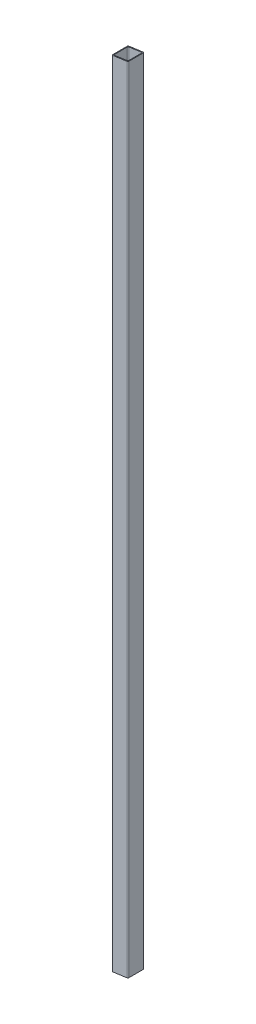
ISO-10303-21;
HEADER;
FILE_DESCRIPTION(('STEP AP214'),'2;1');
FILE_NAME('part.step','',(''),(''),'','','');
FILE_SCHEMA(('AUTOMOTIVE_DESIGN { 1 0 10303 214 1 1 1 1 }'));
ENDSEC;
DATA;
#1=APPLICATION_CONTEXT('core data for automotive mechanical design processes');
#2=APPLICATION_PROTOCOL_DEFINITION('international standard','automotive_design',2000,#1);
#3=PRODUCT_CONTEXT('',#1,'mechanical');
#4=PRODUCT('Part','Part','',(#3));
#5=PRODUCT_RELATED_PRODUCT_CATEGORY('part','',(#4));
#6=PRODUCT_DEFINITION_FORMATION('','',#4);
#7=PRODUCT_DEFINITION_CONTEXT('part definition',#1,'design');
#8=PRODUCT_DEFINITION('design','',#6,#7);
#9=PRODUCT_DEFINITION_SHAPE('','',#8);
#10=(LENGTH_UNIT() NAMED_UNIT(*) SI_UNIT(.MILLI.,.METRE.));
#11=(NAMED_UNIT(*) PLANE_ANGLE_UNIT() SI_UNIT($,.RADIAN.));
#12=(NAMED_UNIT(*) SI_UNIT($,.STERADIAN.) SOLID_ANGLE_UNIT());
#13=UNCERTAINTY_MEASURE_WITH_UNIT(LENGTH_MEASURE(1.E-05),#10,'distance_accuracy_value','');
#14=(GEOMETRIC_REPRESENTATION_CONTEXT(3) GLOBAL_UNCERTAINTY_ASSIGNED_CONTEXT((#13)) GLOBAL_UNIT_ASSIGNED_CONTEXT((#10,
#11,#12)) REPRESENTATION_CONTEXT('',''));
#15=CARTESIAN_POINT('',(0.,0.,0.));
#16=DIRECTION('',(0.,0.,1.));
#17=DIRECTION('',(1.,0.,0.));
#18=AXIS2_PLACEMENT_3D('',#15,#16,#17);
#19=CARTESIAN_POINT('',(5.,4950.,10.));
#20=DIRECTION('',(1.,0.,0.));
#21=DIRECTION('',(0.,0.,-1.));
#22=AXIS2_PLACEMENT_3D('',#19,#20,#21);
#23=PLANE('',#22);
#24=DIRECTION('',(0.,0.,-1.));
#25=VECTOR('',#24,1.);
#26=CARTESIAN_POINT('',(5.,4936.64862070327,10.));
#27=LINE('',#26,#25);
#28=CARTESIAN_POINT('',(5.00000000000001,4936.64862070327,90.));
#29=VERTEX_POINT('',#28);
#30=CARTESIAN_POINT('',(5.,4936.64862070327,10.));
#31=VERTEX_POINT('',#30);
#32=EDGE_CURVE('E11',#29,#31,#27,.T.);
#33=ORIENTED_EDGE('',*,*,#32,.F.);
#34=DIRECTION('',(0.,-1.,0.));
#35=VECTOR('',#34,1.);
#36=CARTESIAN_POINT('',(5.00000000000001,4950.,90.));
#37=LINE('',#36,#35);
#38=CARTESIAN_POINT('',(5.00000000000001,0.702704173511927,90.));
#39=VERTEX_POINT('',#38);
#40=EDGE_CURVE('E220',#29,#39,#37,.T.);
#41=ORIENTED_EDGE('',*,*,#40,.T.);
#42=DIRECTION('',(0.,0.,-1.));
#43=VECTOR('',#42,1.);
#44=CARTESIAN_POINT('',(5.,0.702704173511925,10.0000000000001));
#45=LINE('',#44,#43);
#46=CARTESIAN_POINT('',(5.,0.702704173511925,10.));
#47=VERTEX_POINT('',#46);
#48=EDGE_CURVE('E49',#39,#47,#45,.T.);
#49=ORIENTED_EDGE('',*,*,#48,.T.);
#50=DIRECTION('',(0.,-1.,0.));
#51=VECTOR('',#50,1.);
#52=CARTESIAN_POINT('',(5.,4950.,10.));
#53=LINE('',#52,#51);
#54=EDGE_CURVE('E217',#31,#47,#53,.T.);
#55=ORIENTED_EDGE('',*,*,#54,.F.);
#56=EDGE_LOOP('',(#33,#41,#49,#55));
#57=FACE_BOUND('',#56,.T.);
#58=ADVANCED_FACE('F41',(#57),#23,.T.);
#59=CARTESIAN_POINT('',(10.,4950.,10.));
#60=DIRECTION('',(0.,-1.,0.));
#61=DIRECTION('',(0.,0.,-1.));
#62=AXIS2_PLACEMENT_3D('',#59,#60,#61);
#63=CYLINDRICAL_SURFACE('',#62,5.);
#64=CARTESIAN_POINT('',(10.,4937.35132487678,10.));
#65=DIRECTION('',(0.139173100960068,-0.99026806874157,0.));
#66=DIRECTION('',(-0.99026806874157,-0.139173100960068,0.));
#67=AXIS2_PLACEMENT_3D('',#64,#65,#66);
#68=ELLIPSE('',#67,5.04913786259309,5.);
#69=CARTESIAN_POINT('',(10.,4937.35132487678,5.));
#70=VERTEX_POINT('',#69);
#71=EDGE_CURVE('E169',#31,#70,#68,.T.);
#72=ORIENTED_EDGE('',*,*,#71,.F.);
#73=ORIENTED_EDGE('',*,*,#54,.T.);
#74=CARTESIAN_POINT('',(10.,1.40540834702296,10.));
#75=DIRECTION('',(0.139173100960058,-0.990268068741571,0.));
#76=DIRECTION('',(-0.990268068741571,-0.139173100960058,0.));
#77=AXIS2_PLACEMENT_3D('',#74,#75,#76);
#78=ELLIPSE('',#77,5.04913786259308,5.);
#79=CARTESIAN_POINT('',(10.,1.40540834702296,5.));
#80=VERTEX_POINT('',#79);
#81=EDGE_CURVE('E274',#47,#80,#78,.T.);
#82=ORIENTED_EDGE('',*,*,#81,.T.);
#83=DIRECTION('',(0.,-1.,0.));
#84=VECTOR('',#83,1.);
#85=CARTESIAN_POINT('',(10.,4950.,5.));
#86=LINE('',#85,#84);
#87=EDGE_CURVE('E214',#70,#80,#86,.T.);
#88=ORIENTED_EDGE('',*,*,#87,.F.);
#89=EDGE_LOOP('',(#72,#73,#82,#88));
#90=FACE_BOUND('',#89,.T.);
#91=ADVANCED_FACE('F314',(#90),#63,.F.);
#92=CARTESIAN_POINT('',(10.,4950.,5.));
#93=DIRECTION('',(0.,0.,1.));
#94=DIRECTION('',(1.,0.,0.));
#95=AXIS2_PLACEMENT_3D('',#92,#93,#94);
#96=PLANE('',#95);
#97=DIRECTION('',(0.99026806874157,0.139173100960068,0.));
#98=VECTOR('',#97,1.);
#99=CARTESIAN_POINT('',(11.7432236827758,4937.59631898823,5.));
#100=LINE('',#99,#98);
#101=CARTESIAN_POINT('',(90.,4948.59459165298,4.99999999999998));
#102=VERTEX_POINT('',#101);
#103=EDGE_CURVE('E246',#70,#102,#100,.T.);
#104=ORIENTED_EDGE('',*,*,#103,.F.);
#105=ORIENTED_EDGE('',*,*,#87,.T.);
#106=DIRECTION('',(0.990268068741571,0.139173100960058,0.));
#107=VECTOR('',#106,1.);
#108=CARTESIAN_POINT('',(692.008764126731,97.2554893317348,4.99999999999987));
#109=LINE('',#108,#107);
#110=CARTESIAN_POINT('',(90.,12.6486751232133,4.99999999999998));
#111=VERTEX_POINT('',#110);
#112=EDGE_CURVE('E271',#80,#111,#109,.T.);
#113=ORIENTED_EDGE('',*,*,#112,.T.);
#114=DIRECTION('',(0.,-1.,0.));
#115=VECTOR('',#114,1.);
#116=CARTESIAN_POINT('',(90.,4950.,4.99999999999998));
#117=LINE('',#116,#115);
#118=EDGE_CURVE('E211',#102,#111,#117,.T.);
#119=ORIENTED_EDGE('',*,*,#118,.F.);
#120=EDGE_LOOP('',(#104,#105,#113,#119));
#121=FACE_BOUND('',#120,.T.);
#122=ADVANCED_FACE('F320',(#121),#96,.T.);
#123=CARTESIAN_POINT('',(90.,4950.,9.99999999999998));
#124=DIRECTION('',(0.,-1.,0.));
#125=DIRECTION('',(0.,0.,-1.));
#126=AXIS2_PLACEMENT_3D('',#123,#124,#125);
#127=CYLINDRICAL_SURFACE('',#126,5.);
#128=CARTESIAN_POINT('',(90.,4948.59459165298,9.99999999999998));
#129=DIRECTION('',(0.139173100960068,-0.99026806874157,0.));
#130=DIRECTION('',(-0.99026806874157,-0.139173100960068,0.));
#131=AXIS2_PLACEMENT_3D('',#128,#129,#130);
#132=ELLIPSE('',#131,5.04913786259309,5.);
#133=CARTESIAN_POINT('',(95.,4949.29729582649,10.));
#134=VERTEX_POINT('',#133);
#135=EDGE_CURVE('E244',#102,#134,#132,.T.);
#136=ORIENTED_EDGE('',*,*,#135,.F.);
#137=ORIENTED_EDGE('',*,*,#118,.T.);
#138=CARTESIAN_POINT('',(90.,12.6486751232147,9.99999999999998));
#139=DIRECTION('',(0.139173100960058,-0.990268068741571,0.));
#140=DIRECTION('',(-0.990268068741571,-0.139173100960058,0.));
#141=AXIS2_PLACEMENT_3D('',#138,#139,#140);
#142=ELLIPSE('',#141,5.04913786259309,5.);
#143=CARTESIAN_POINT('',(95.,13.3513792967266,10.));
#144=VERTEX_POINT('',#143);
#145=EDGE_CURVE('E268',#111,#144,#142,.T.);
#146=ORIENTED_EDGE('',*,*,#145,.T.);
#147=DIRECTION('',(0.,-1.,0.));
#148=VECTOR('',#147,1.);
#149=CARTESIAN_POINT('',(95.,4950.,10.));
#150=LINE('',#149,#148);
#151=EDGE_CURVE('E208',#134,#144,#150,.T.);
#152=ORIENTED_EDGE('',*,*,#151,.F.);
#153=EDGE_LOOP('',(#136,#137,#146,#152));
#154=FACE_BOUND('',#153,.T.);
#155=ADVANCED_FACE('F328',(#154),#127,.F.);
#156=CARTESIAN_POINT('',(95.,4950.,10.));
#157=DIRECTION('',(-1.,0.,0.));
#158=DIRECTION('',(0.,0.,1.));
#159=AXIS2_PLACEMENT_3D('',#156,#157,#158);
#160=PLANE('',#159);
#161=DIRECTION('',(0.,0.,1.));
#162=VECTOR('',#161,1.);
#163=CARTESIAN_POINT('',(95.,4949.29729582649,10.));
#164=LINE('',#163,#162);
#165=CARTESIAN_POINT('',(95.,4949.29729582649,90.));
#166=VERTEX_POINT('',#165);
#167=EDGE_CURVE('E242',#134,#166,#164,.T.);
#168=ORIENTED_EDGE('',*,*,#167,.F.);
#169=ORIENTED_EDGE('',*,*,#151,.T.);
#170=DIRECTION('',(0.,0.,1.));
#171=VECTOR('',#170,1.);
#172=CARTESIAN_POINT('',(95.,13.3513792967257,9.9999999999999));
#173=LINE('',#172,#171);
#174=CARTESIAN_POINT('',(95.,13.3513792967257,90.));
#175=VERTEX_POINT('',#174);
#176=EDGE_CURVE('E265',#144,#175,#173,.T.);
#177=ORIENTED_EDGE('',*,*,#176,.T.);
#178=DIRECTION('',(0.,-1.,0.));
#179=VECTOR('',#178,1.);
#180=CARTESIAN_POINT('',(95.,4950.,90.));
#181=LINE('',#180,#179);
#182=EDGE_CURVE('E205',#166,#175,#181,.T.);
#183=ORIENTED_EDGE('',*,*,#182,.F.);
#184=EDGE_LOOP('',(#168,#169,#177,#183));
#185=FACE_BOUND('',#184,.T.);
#186=ADVANCED_FACE('F332',(#185),#160,.T.);
#187=CARTESIAN_POINT('',(90.,4950.,90.));
#188=DIRECTION('',(0.,-1.,0.));
#189=DIRECTION('',(0.,0.,-1.));
#190=AXIS2_PLACEMENT_3D('',#187,#188,#189);
#191=CYLINDRICAL_SURFACE('',#190,5.);
#192=CARTESIAN_POINT('',(90.,4948.59459165298,90.));
#193=DIRECTION('',(0.139173100960068,-0.99026806874157,0.));
#194=DIRECTION('',(-0.99026806874157,-0.139173100960068,0.));
#195=AXIS2_PLACEMENT_3D('',#192,#193,#194);
#196=ELLIPSE('',#195,5.0491378625931,5.);
#197=CARTESIAN_POINT('',(90.,4948.59459165298,95.));
#198=VERTEX_POINT('',#197);
#199=EDGE_CURVE('E240',#166,#198,#196,.T.);
#200=ORIENTED_EDGE('',*,*,#199,.F.);
#201=ORIENTED_EDGE('',*,*,#182,.T.);
#202=CARTESIAN_POINT('',(90.,12.6486751232147,90.));
#203=DIRECTION('',(0.139173100960058,-0.990268068741571,0.));
#204=DIRECTION('',(-0.990268068741571,-0.139173100960058,0.));
#205=AXIS2_PLACEMENT_3D('',#202,#203,#204);
#206=ELLIPSE('',#205,5.04913786259309,5.);
#207=CARTESIAN_POINT('',(90.,12.6486751232147,95.));
#208=VERTEX_POINT('',#207);
#209=EDGE_CURVE('E262',#175,#208,#206,.T.);
#210=ORIENTED_EDGE('',*,*,#209,.T.);
#211=DIRECTION('',(0.,-1.,0.));
#212=VECTOR('',#211,1.);
#213=CARTESIAN_POINT('',(90.,4950.,95.));
#214=LINE('',#213,#212);
#215=EDGE_CURVE('E202',#198,#208,#214,.T.);
#216=ORIENTED_EDGE('',*,*,#215,.F.);
#217=EDGE_LOOP('',(#200,#201,#210,#216));
#218=FACE_BOUND('',#217,.T.);
#219=ADVANCED_FACE('F336',(#218),#191,.F.);
#220=CARTESIAN_POINT('',(10.,4950.,95.));
#221=DIRECTION('',(0.,0.,-1.));
#222=DIRECTION('',(-1.,0.,0.));
#223=AXIS2_PLACEMENT_3D('',#220,#221,#222);
#224=PLANE('',#223);
#225=DIRECTION('',(-0.99026806874157,-0.139173100960068,0.));
#226=VECTOR('',#225,1.);
#227=CARTESIAN_POINT('',(11.7432236827758,4937.59631898823,95.));
#228=LINE('',#227,#226);
#229=CARTESIAN_POINT('',(10.,4937.35132487678,95.));
#230=VERTEX_POINT('',#229);
#231=EDGE_CURVE('E238',#198,#230,#228,.T.);
#232=ORIENTED_EDGE('',*,*,#231,.F.);
#233=ORIENTED_EDGE('',*,*,#215,.T.);
#234=DIRECTION('',(-0.990268068741571,-0.139173100960058,0.));
#235=VECTOR('',#234,1.);
#236=CARTESIAN_POINT('',(692.008764126731,97.2554893317348,94.9999999999999));
#237=LINE('',#236,#235);
#238=CARTESIAN_POINT('',(10.,1.4054083470226,95.));
#239=VERTEX_POINT('',#238);
#240=EDGE_CURVE('E259',#208,#239,#237,.T.);
#241=ORIENTED_EDGE('',*,*,#240,.T.);
#242=DIRECTION('',(0.,-1.,0.));
#243=VECTOR('',#242,1.);
#244=CARTESIAN_POINT('',(10.,4950.,95.));
#245=LINE('',#244,#243);
#246=EDGE_CURVE('E198',#230,#239,#245,.T.);
#247=ORIENTED_EDGE('',*,*,#246,.F.);
#248=EDGE_LOOP('',(#232,#233,#241,#247));
#249=FACE_BOUND('',#248,.T.);
#250=ADVANCED_FACE('F340',(#249),#224,.T.);
#251=CARTESIAN_POINT('',(10.,4950.,90.));
#252=DIRECTION('',(0.,-1.,0.));
#253=DIRECTION('',(0.,0.,-1.));
#254=AXIS2_PLACEMENT_3D('',#251,#252,#253);
#255=CYLINDRICAL_SURFACE('',#254,5.);
#256=CARTESIAN_POINT('',(10.,4937.35132487678,90.));
#257=DIRECTION('',(0.139173100960068,-0.99026806874157,0.));
#258=DIRECTION('',(-0.99026806874157,-0.139173100960068,0.));
#259=AXIS2_PLACEMENT_3D('',#256,#257,#258);
#260=ELLIPSE('',#259,5.04913786259309,5.);
#261=EDGE_CURVE('E63',#230,#29,#260,.T.);
#262=ORIENTED_EDGE('',*,*,#261,.F.);
#263=ORIENTED_EDGE('',*,*,#246,.T.);
#264=CARTESIAN_POINT('',(10.,1.40540834702296,90.));
#265=DIRECTION('',(0.139173100960058,-0.990268068741571,0.));
#266=DIRECTION('',(-0.990268068741571,-0.139173100960058,0.));
#267=AXIS2_PLACEMENT_3D('',#264,#265,#266);
#268=ELLIPSE('',#267,5.04913786259309,5.);
#269=EDGE_CURVE('E256',#239,#39,#268,.T.);
#270=ORIENTED_EDGE('',*,*,#269,.T.);
#271=ORIENTED_EDGE('',*,*,#40,.F.);
#272=EDGE_LOOP('',(#262,#263,#270,#271));
#273=FACE_BOUND('',#272,.T.);
#274=ADVANCED_FACE('F343',(#273),#255,.F.);
#275=CARTESIAN_POINT('',(100.,14.0540834702384,1000.));
#276=DIRECTION('',(0.139173100960058,-0.990268068741571,0.));
#277=DIRECTION('',(0.990268068741571,0.139173100960058,0.));
#278=AXIS2_PLACEMENT_3D('',#275,#276,#277);
#279=PLANE('',#278);
#280=ORIENTED_EDGE('',*,*,#240,.F.);
#281=ORIENTED_EDGE('',*,*,#209,.F.);
#282=ORIENTED_EDGE('',*,*,#176,.F.);
#283=ORIENTED_EDGE('',*,*,#145,.F.);
#284=ORIENTED_EDGE('',*,*,#112,.F.);
#285=ORIENTED_EDGE('',*,*,#81,.F.);
#286=ORIENTED_EDGE('',*,*,#48,.F.);
#287=ORIENTED_EDGE('',*,*,#269,.F.);
#288=EDGE_LOOP('',(#280,#281,#282,#283,#284,#285,#286,#287));
#289=FACE_BOUND('',#288,.T.);
#290=CARTESIAN_POINT('',(95.,13.3513792967257,5.));
#291=DIRECTION('',(0.139173100960058,-0.990268068741571,0.));
#292=DIRECTION('',(-0.990268068741571,-0.139173100960058,0.));
#293=AXIS2_PLACEMENT_3D('',#290,#291,#292);
#294=ELLIPSE('',#293,5.04913786259309,5.);
#295=CARTESIAN_POINT('',(94.9999999999999,13.3513792967265,0.));
#296=VERTEX_POINT('',#295);
#297=CARTESIAN_POINT('',(100.,14.0540834702385,5.00000000000004));
#298=VERTEX_POINT('',#297);
#299=EDGE_CURVE('E56',#296,#298,#294,.T.);
#300=ORIENTED_EDGE('',*,*,#299,.T.);
#301=DIRECTION('',(0.,0.,-1.));
#302=VECTOR('',#301,1.);
#303=CARTESIAN_POINT('',(100.,14.0540834702384,1000.));
#304=LINE('',#303,#302);
#305=CARTESIAN_POINT('',(100.,14.0540834702384,95.));
#306=VERTEX_POINT('',#305);
#307=EDGE_CURVE('E160',#306,#298,#304,.T.);
#308=ORIENTED_EDGE('',*,*,#307,.F.);
#309=CARTESIAN_POINT('',(95.,13.3513792967257,95.));
#310=DIRECTION('',(0.139173100960058,-0.990268068741571,0.));
#311=DIRECTION('',(-0.990268068741571,-0.139173100960058,0.));
#312=AXIS2_PLACEMENT_3D('',#309,#310,#311);
#313=ELLIPSE('',#312,5.04913786259309,5.);
#314=CARTESIAN_POINT('',(95.,13.3513792967257,100.));
#315=VERTEX_POINT('',#314);
#316=EDGE_CURVE('E254',#306,#315,#313,.T.);
#317=ORIENTED_EDGE('',*,*,#316,.T.);
#318=DIRECTION('',(-0.990268068741571,-0.139173100960058,0.));
#319=VECTOR('',#318,1.);
#320=CARTESIAN_POINT('',(687.105609886885,96.566395942193,100.));
#321=LINE('',#320,#319);
#322=CARTESIAN_POINT('',(5.00000000000012,0.70270417351137,100.));
#323=VERTEX_POINT('',#322);
#324=EDGE_CURVE('E252',#315,#323,#321,.T.);
#325=ORIENTED_EDGE('',*,*,#324,.T.);
#326=CARTESIAN_POINT('',(5.00000000000001,0.702704173511925,95.));
#327=DIRECTION('',(0.139173100960058,-0.990268068741571,0.));
#328=DIRECTION('',(-0.990268068741571,-0.139173100960058,0.));
#329=AXIS2_PLACEMENT_3D('',#326,#327,#328);
#330=ELLIPSE('',#329,5.04913786259309,5.);
#331=CARTESIAN_POINT('',(0.,0.,95.));
#332=VERTEX_POINT('',#331);
#333=EDGE_CURVE('E250',#323,#332,#330,.T.);
#334=ORIENTED_EDGE('',*,*,#333,.T.);
#335=DIRECTION('',(0.,0.,1.));
#336=VECTOR('',#335,1.);
#337=CARTESIAN_POINT('',(0.,0.,5.00000000000004));
#338=LINE('',#337,#336);
#339=CARTESIAN_POINT('',(0.,0.,5.));
#340=VERTEX_POINT('',#339);
#341=EDGE_CURVE('E195',#340,#332,#338,.T.);
#342=ORIENTED_EDGE('',*,*,#341,.F.);
#343=CARTESIAN_POINT('',(5.,0.702704173511925,5.));
#344=DIRECTION('',(0.139173100960058,-0.990268068741571,0.));
#345=DIRECTION('',(-0.990268068741571,-0.139173100960058,0.));
#346=AXIS2_PLACEMENT_3D('',#343,#344,#345);
#347=ELLIPSE('',#346,5.04913786259308,5.);
#348=CARTESIAN_POINT('',(5.,0.702704173511922,0.));
#349=VERTEX_POINT('',#348);
#350=EDGE_CURVE('E154',#340,#349,#347,.T.);
#351=ORIENTED_EDGE('',*,*,#350,.T.);
#352=DIRECTION('',(-0.990268068741571,-0.139173100960058,0.));
#353=VECTOR('',#352,1.);
#354=CARTESIAN_POINT('',(100.,14.0540834702384,0.));
#355=LINE('',#354,#353);
#356=EDGE_CURVE('E151',#296,#349,#355,.T.);
#357=ORIENTED_EDGE('',*,*,#356,.F.);
#358=EDGE_LOOP('',(#300,#308,#317,#325,#334,#342,#351,#357));
#359=FACE_BOUND('',#358,.T.);
#360=ADVANCED_FACE('F152',(#289,#359),#279,.T.);
#361=CARTESIAN_POINT('',(-680.265540444001,4840.34082965648,1000.));
#362=DIRECTION('',(0.139173100960068,-0.99026806874157,0.));
#363=DIRECTION('',(0.99026806874157,0.139173100960068,0.));
#364=AXIS2_PLACEMENT_3D('',#361,#362,#363);
#365=PLANE('',#364);
#366=ORIENTED_EDGE('',*,*,#261,.T.);
#367=ORIENTED_EDGE('',*,*,#32,.T.);
#368=ORIENTED_EDGE('',*,*,#71,.T.);
#369=ORIENTED_EDGE('',*,*,#103,.T.);
#370=ORIENTED_EDGE('',*,*,#135,.T.);
#371=ORIENTED_EDGE('',*,*,#167,.T.);
#372=ORIENTED_EDGE('',*,*,#199,.T.);
#373=ORIENTED_EDGE('',*,*,#231,.T.);
#374=EDGE_LOOP('',(#366,#367,#368,#369,#370,#371,#372,#373));
#375=FACE_BOUND('',#374,.T.);
#376=DIRECTION('',(-0.99026806874157,-0.139173100960068,0.));
#377=VECTOR('',#376,1.);
#378=CARTESIAN_POINT('',(-680.265540444001,4840.34082965648,0.));
#379=LINE('',#378,#377);
#380=CARTESIAN_POINT('',(94.9999999999999,4949.29729582649,0.));
#381=VERTEX_POINT('',#380);
#382=CARTESIAN_POINT('',(5.00000000000006,4936.64862070327,0.));
#383=VERTEX_POINT('',#382);
#384=EDGE_CURVE('E159',#381,#383,#379,.T.);
#385=ORIENTED_EDGE('',*,*,#384,.T.);
#386=CARTESIAN_POINT('',(5.,4936.64862070327,5.));
#387=DIRECTION('',(0.139173100960068,-0.99026806874157,0.));
#388=DIRECTION('',(-0.99026806874157,-0.139173100960068,0.));
#389=AXIS2_PLACEMENT_3D('',#386,#387,#388);
#390=ELLIPSE('',#389,5.04913786259309,5.);
#391=CARTESIAN_POINT('',(0.,4935.94591652976,5.));
#392=VERTEX_POINT('',#391);
#393=EDGE_CURVE('E225',#392,#383,#390,.T.);
#394=ORIENTED_EDGE('',*,*,#393,.F.);
#395=DIRECTION('',(0.,0.,-1.));
#396=VECTOR('',#395,1.);
#397=CARTESIAN_POINT('',(0.,4935.94591652976,1000.));
#398=LINE('',#397,#396);
#399=CARTESIAN_POINT('',(0.,4935.94591652976,95.));
#400=VERTEX_POINT('',#399);
#401=EDGE_CURVE('E276',#400,#392,#398,.T.);
#402=ORIENTED_EDGE('',*,*,#401,.F.);
#403=CARTESIAN_POINT('',(5.00000000000001,4936.64862070327,95.));
#404=DIRECTION('',(0.139173100960068,-0.99026806874157,0.));
#405=DIRECTION('',(-0.99026806874157,-0.139173100960068,0.));
#406=AXIS2_PLACEMENT_3D('',#403,#404,#405);
#407=ELLIPSE('',#406,5.04913786259309,5.);
#408=CARTESIAN_POINT('',(5.00000000000005,4936.64862070327,100.));
#409=VERTEX_POINT('',#408);
#410=EDGE_CURVE('E228',#409,#400,#407,.T.);
#411=ORIENTED_EDGE('',*,*,#410,.F.);
#412=DIRECTION('',(-0.99026806874157,-0.139173100960068,0.));
#413=VECTOR('',#412,1.);
#414=CARTESIAN_POINT('',(6.84006944293005,4936.90722559869,100.));
#415=LINE('',#414,#413);
#416=CARTESIAN_POINT('',(95.,4949.29729582649,100.));
#417=VERTEX_POINT('',#416);
#418=EDGE_CURVE('E231',#417,#409,#415,.T.);
#419=ORIENTED_EDGE('',*,*,#418,.F.);
#420=CARTESIAN_POINT('',(95.,4949.29729582649,95.));
#421=DIRECTION('',(0.139173100960068,-0.99026806874157,0.));
#422=DIRECTION('',(-0.99026806874157,-0.139173100960068,0.));
#423=AXIS2_PLACEMENT_3D('',#420,#421,#422);
#424=ELLIPSE('',#423,5.0491378625931,5.);
#425=CARTESIAN_POINT('',(100.,4950.,95.));
#426=VERTEX_POINT('',#425);
#427=EDGE_CURVE('E234',#426,#417,#424,.T.);
#428=ORIENTED_EDGE('',*,*,#427,.F.);
#429=DIRECTION('',(0.,0.,-1.));
#430=VECTOR('',#429,1.);
#431=CARTESIAN_POINT('',(100.,4950.,5.00000000000004));
#432=LINE('',#431,#430);
#433=CARTESIAN_POINT('',(100.,4950.,5.));
#434=VERTEX_POINT('',#433);
#435=EDGE_CURVE('E194',#426,#434,#432,.T.);
#436=ORIENTED_EDGE('',*,*,#435,.T.);
#437=CARTESIAN_POINT('',(95.,4949.29729582649,5.));
#438=DIRECTION('',(0.139173100960068,-0.99026806874157,0.));
#439=DIRECTION('',(-0.99026806874157,-0.139173100960068,0.));
#440=AXIS2_PLACEMENT_3D('',#437,#438,#439);
#441=ELLIPSE('',#440,5.04913786259309,5.);
#442=EDGE_CURVE('E223',#381,#434,#441,.T.);
#443=ORIENTED_EDGE('',*,*,#442,.F.);
#444=EDGE_LOOP('',(#385,#394,#402,#411,#419,#428,#436,#443));
#445=FACE_BOUND('',#444,.T.);
#446=ADVANCED_FACE('F282',(#375,#445),#365,.F.);
#447=CARTESIAN_POINT('',(95.,4950.,5.));
#448=DIRECTION('',(0.,-1.,0.));
#449=DIRECTION('',(0.,0.,-1.));
#450=AXIS2_PLACEMENT_3D('',#447,#448,#449);
#451=CYLINDRICAL_SURFACE('',#450,5.);
#452=DIRECTION('',(0.,-1.,0.));
#453=VECTOR('',#452,1.);
#454=CARTESIAN_POINT('',(95.,4950.,0.));
#455=LINE('',#454,#453);
#456=EDGE_CURVE('E166',#381,#296,#455,.T.);
#457=ORIENTED_EDGE('',*,*,#456,.F.);
#458=ORIENTED_EDGE('',*,*,#442,.T.);
#459=DIRECTION('',(0.,-1.,0.));
#460=VECTOR('',#459,1.);
#461=CARTESIAN_POINT('',(100.,4950.,5.00000000000004));
#462=LINE('',#461,#460);
#463=EDGE_CURVE('E168',#434,#298,#462,.T.);
#464=ORIENTED_EDGE('',*,*,#463,.T.);
#465=ORIENTED_EDGE('',*,*,#299,.F.);
#466=EDGE_LOOP('',(#457,#458,#464,#465));
#467=FACE_BOUND('',#466,.T.);
#468=ADVANCED_FACE('F43',(#467),#451,.T.);
#469=CARTESIAN_POINT('',(5.00000000000004,4950.,0.));
#470=DIRECTION('',(0.,0.,1.));
#471=DIRECTION('',(1.,0.,0.));
#472=AXIS2_PLACEMENT_3D('',#469,#470,#471);
#473=PLANE('',#472);
#474=DIRECTION('',(0.,-1.,0.));
#475=VECTOR('',#474,1.);
#476=CARTESIAN_POINT('',(5.00000000000004,4950.,0.));
#477=LINE('',#476,#475);
#478=EDGE_CURVE('E173',#383,#349,#477,.T.);
#479=ORIENTED_EDGE('',*,*,#478,.F.);
#480=ORIENTED_EDGE('',*,*,#384,.F.);
#481=ORIENTED_EDGE('',*,*,#456,.T.);
#482=ORIENTED_EDGE('',*,*,#356,.T.);
#483=EDGE_LOOP('',(#479,#480,#481,#482));
#484=FACE_BOUND('',#483,.T.);
#485=ADVANCED_FACE('F172',(#484),#473,.F.);
#486=CARTESIAN_POINT('',(5.,4950.,5.));
#487=DIRECTION('',(0.,-1.,0.));
#488=DIRECTION('',(0.,0.,-1.));
#489=AXIS2_PLACEMENT_3D('',#486,#487,#488);
#490=CYLINDRICAL_SURFACE('',#489,5.);
#491=DIRECTION('',(0.,-1.,0.));
#492=VECTOR('',#491,1.);
#493=CARTESIAN_POINT('',(0.,4950.,5.00000000000004));
#494=LINE('',#493,#492);
#495=EDGE_CURVE('E176',#392,#340,#494,.T.);
#496=ORIENTED_EDGE('',*,*,#495,.F.);
#497=ORIENTED_EDGE('',*,*,#393,.T.);
#498=ORIENTED_EDGE('',*,*,#478,.T.);
#499=ORIENTED_EDGE('',*,*,#350,.F.);
#500=EDGE_LOOP('',(#496,#497,#498,#499));
#501=FACE_BOUND('',#500,.T.);
#502=ADVANCED_FACE('F285',(#501),#490,.T.);
#503=CARTESIAN_POINT('',(5.00000000000001,4950.,95.));
#504=DIRECTION('',(0.,-1.,0.));
#505=DIRECTION('',(0.,0.,-1.));
#506=AXIS2_PLACEMENT_3D('',#503,#504,#505);
#507=CYLINDRICAL_SURFACE('',#506,5.);
#508=DIRECTION('',(0.,-1.,0.));
#509=VECTOR('',#508,1.);
#510=CARTESIAN_POINT('',(5.00000000000005,4950.,100.));
#511=LINE('',#510,#509);
#512=EDGE_CURVE('E184',#409,#323,#511,.T.);
#513=ORIENTED_EDGE('',*,*,#512,.F.);
#514=ORIENTED_EDGE('',*,*,#410,.T.);
#515=DIRECTION('',(0.,-1.,0.));
#516=VECTOR('',#515,1.);
#517=CARTESIAN_POINT('',(0.,4950.,95.));
#518=LINE('',#517,#516);
#519=EDGE_CURVE('E181',#400,#332,#518,.T.);
#520=ORIENTED_EDGE('',*,*,#519,.T.);
#521=ORIENTED_EDGE('',*,*,#333,.F.);
#522=EDGE_LOOP('',(#513,#514,#520,#521));
#523=FACE_BOUND('',#522,.T.);
#524=ADVANCED_FACE('F291',(#523),#507,.T.);
#525=CARTESIAN_POINT('',(5.00000000000005,4950.,100.));
#526=DIRECTION('',(0.,0.,-1.));
#527=DIRECTION('',(-1.,0.,0.));
#528=AXIS2_PLACEMENT_3D('',#525,#526,#527);
#529=PLANE('',#528);
#530=DIRECTION('',(0.,-1.,0.));
#531=VECTOR('',#530,1.);
#532=CARTESIAN_POINT('',(95.,4950.,100.));
#533=LINE('',#532,#531);
#534=EDGE_CURVE('E187',#417,#315,#533,.T.);
#535=ORIENTED_EDGE('',*,*,#534,.F.);
#536=ORIENTED_EDGE('',*,*,#418,.T.);
#537=ORIENTED_EDGE('',*,*,#512,.T.);
#538=ORIENTED_EDGE('',*,*,#324,.F.);
#539=EDGE_LOOP('',(#535,#536,#537,#538));
#540=FACE_BOUND('',#539,.T.);
#541=ADVANCED_FACE('F296',(#540),#529,.F.);
#542=CARTESIAN_POINT('',(95.,4950.,95.));
#543=DIRECTION('',(0.,-1.,0.));
#544=DIRECTION('',(0.,0.,-1.));
#545=AXIS2_PLACEMENT_3D('',#542,#543,#544);
#546=CYLINDRICAL_SURFACE('',#545,5.);
#547=DIRECTION('',(0.,-1.,0.));
#548=VECTOR('',#547,1.);
#549=CARTESIAN_POINT('',(100.,4950.,95.));
#550=LINE('',#549,#548);
#551=EDGE_CURVE('E190',#426,#306,#550,.T.);
#552=ORIENTED_EDGE('',*,*,#551,.F.);
#553=ORIENTED_EDGE('',*,*,#427,.T.);
#554=ORIENTED_EDGE('',*,*,#534,.T.);
#555=ORIENTED_EDGE('',*,*,#316,.F.);
#556=EDGE_LOOP('',(#552,#553,#554,#555));
#557=FACE_BOUND('',#556,.T.);
#558=ADVANCED_FACE('F299',(#557),#546,.T.);
#559=CARTESIAN_POINT('',(100.,4950.,5.00000000000004));
#560=DIRECTION('',(-1.,0.,0.));
#561=DIRECTION('',(0.,0.,1.));
#562=AXIS2_PLACEMENT_3D('',#559,#560,#561);
#563=PLANE('',#562);
#564=ORIENTED_EDGE('',*,*,#307,.T.);
#565=ORIENTED_EDGE('',*,*,#463,.F.);
#566=ORIENTED_EDGE('',*,*,#435,.F.);
#567=ORIENTED_EDGE('',*,*,#551,.T.);
#568=EDGE_LOOP('',(#564,#565,#566,#567));
#569=FACE_BOUND('',#568,.T.);
#570=ADVANCED_FACE('F303',(#569),#563,.F.);
#571=CARTESIAN_POINT('',(0.,4950.,5.00000000000004));
#572=DIRECTION('',(1.,0.,0.));
#573=DIRECTION('',(0.,0.,-1.));
#574=AXIS2_PLACEMENT_3D('',#571,#572,#573);
#575=PLANE('',#574);
#576=ORIENTED_EDGE('',*,*,#519,.F.);
#577=ORIENTED_EDGE('',*,*,#401,.T.);
#578=ORIENTED_EDGE('',*,*,#495,.T.);
#579=ORIENTED_EDGE('',*,*,#341,.T.);
#580=EDGE_LOOP('',(#576,#577,#578,#579));
#581=FACE_BOUND('',#580,.T.);
#582=ADVANCED_FACE('F288',(#581),#575,.F.);
#583=CLOSED_SHELL('',(#58,#91,#122,#155,#186,#219,#250,#274,#360,#446,#468,#485,#502,#524,#541,
#558,#570,#582));
#584=MANIFOLD_SOLID_BREP('B2',#583);
#585=ADVANCED_BREP_SHAPE_REPRESENTATION('',(#18,#584),#14);
#586=SHAPE_DEFINITION_REPRESENTATION(#9,#585);
ENDSEC;
END-ISO-10303-21;
